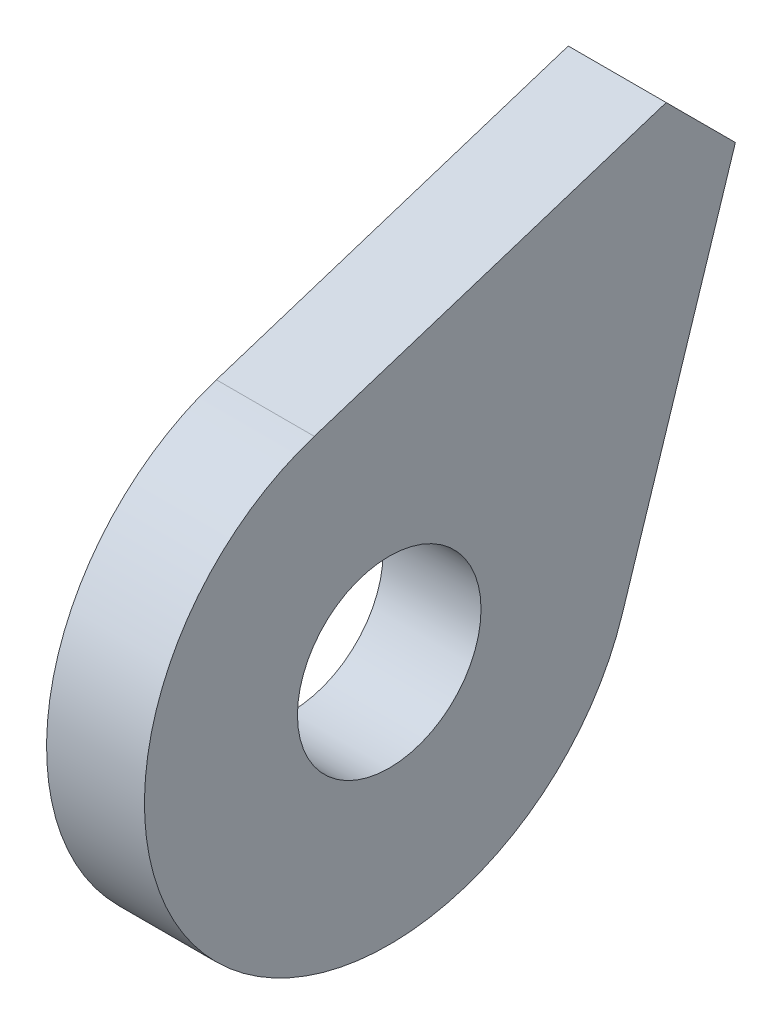
ISO-10303-21;
HEADER;
FILE_DESCRIPTION(('STEP AP214'),'2;1');
FILE_NAME('part.step','',(''),(''),'','','');
FILE_SCHEMA(('AUTOMOTIVE_DESIGN { 1 0 10303 214 1 1 1 1 }'));
ENDSEC;
DATA;
#1=APPLICATION_CONTEXT('core data for automotive mechanical design processes');
#2=APPLICATION_PROTOCOL_DEFINITION('international standard','automotive_design',2000,#1);
#3=PRODUCT_CONTEXT('',#1,'mechanical');
#4=PRODUCT('Part','Part','',(#3));
#5=PRODUCT_RELATED_PRODUCT_CATEGORY('part','',(#4));
#6=PRODUCT_DEFINITION_FORMATION('','',#4);
#7=PRODUCT_DEFINITION_CONTEXT('part definition',#1,'design');
#8=PRODUCT_DEFINITION('design','',#6,#7);
#9=PRODUCT_DEFINITION_SHAPE('','',#8);
#10=(LENGTH_UNIT() NAMED_UNIT(*) SI_UNIT(.MILLI.,.METRE.));
#11=(NAMED_UNIT(*) PLANE_ANGLE_UNIT() SI_UNIT($,.RADIAN.));
#12=(NAMED_UNIT(*) SI_UNIT($,.STERADIAN.) SOLID_ANGLE_UNIT());
#13=UNCERTAINTY_MEASURE_WITH_UNIT(LENGTH_MEASURE(1.E-05),#10,'distance_accuracy_value','');
#14=(GEOMETRIC_REPRESENTATION_CONTEXT(3) GLOBAL_UNCERTAINTY_ASSIGNED_CONTEXT((#13)) GLOBAL_UNIT_ASSIGNED_CONTEXT((#10,
#11,#12)) REPRESENTATION_CONTEXT('',''));
#15=CARTESIAN_POINT('',(0.,0.,0.));
#16=DIRECTION('',(0.,0.,1.));
#17=DIRECTION('',(1.,0.,0.));
#18=AXIS2_PLACEMENT_3D('',#15,#16,#17);
#19=CARTESIAN_POINT('',(-286.7,69.3032187234195,76.8150271270258));
#20=DIRECTION('',(1.,0.,0.));
#21=DIRECTION('',(0.,0.,-1.));
#22=AXIS2_PLACEMENT_3D('',#19,#20,#21);
#23=CYLINDRICAL_SURFACE('',#22,10.);
#24=CARTESIAN_POINT('',(-282.7,69.3032187234195,76.8150271270258));
#25=DIRECTION('',(1.,0.,0.));
#26=DIRECTION('',(0.,0.,-1.));
#27=AXIS2_PLACEMENT_3D('',#24,#25,#26);
#28=CIRCLE('',#27,10.);
#29=CARTESIAN_POINT('',(-282.7,78.823176292621,79.8761393236959));
#30=VERTEX_POINT('',#29);
#31=CARTESIAN_POINT('',(-282.7,66.2421065267494,67.2950695578243));
#32=VERTEX_POINT('',#31);
#33=EDGE_CURVE('E45',#30,#32,#28,.T.);
#34=ORIENTED_EDGE('',*,*,#33,.F.);
#35=DIRECTION('',(1.,0.,0.));
#36=VECTOR('',#35,1.);
#37=CARTESIAN_POINT('',(-286.7,78.823176292621,79.8761393236959));
#38=LINE('',#37,#36);
#39=CARTESIAN_POINT('',(-286.7,78.823176292621,79.8761393236959));
#40=VERTEX_POINT('',#39);
#41=EDGE_CURVE('E39',#40,#30,#38,.T.);
#42=ORIENTED_EDGE('',*,*,#41,.F.);
#43=CARTESIAN_POINT('',(-286.7,69.3032187234195,76.8150271270258));
#44=DIRECTION('',(1.,0.,0.));
#45=DIRECTION('',(0.,0.,-1.));
#46=AXIS2_PLACEMENT_3D('',#43,#44,#45);
#47=CIRCLE('',#46,10.);
#48=CARTESIAN_POINT('',(-286.7,66.2421065267494,67.2950695578243));
#49=VERTEX_POINT('',#48);
#50=EDGE_CURVE('E105',#40,#49,#47,.T.);
#51=ORIENTED_EDGE('',*,*,#50,.T.);
#52=DIRECTION('',(1.,0.,0.));
#53=VECTOR('',#52,1.);
#54=CARTESIAN_POINT('',(-286.7,66.2421065267494,67.2950695578243));
#55=LINE('',#54,#53);
#56=EDGE_CURVE('E54',#49,#32,#55,.T.);
#57=ORIENTED_EDGE('',*,*,#56,.T.);
#58=EDGE_LOOP('',(#34,#42,#51,#57));
#59=FACE_BOUND('',#58,.T.);
#60=ADVANCED_FACE('F36',(#59),#23,.T.);
#61=CARTESIAN_POINT('',(-286.7,69.3032187234195,76.8150271270258));
#62=DIRECTION('',(1.,0.,0.));
#63=DIRECTION('',(0.,0.,-1.));
#64=AXIS2_PLACEMENT_3D('',#61,#62,#63);
#65=CYLINDRICAL_SURFACE('',#64,3.75000000000001);
#66=CARTESIAN_POINT('',(-286.7,69.3032187234195,76.8150271270258));
#67=DIRECTION('',(1.,0.,0.));
#68=DIRECTION('',(0.,0.,-1.));
#69=AXIS2_PLACEMENT_3D('',#66,#67,#68);
#70=CIRCLE('',#69,3.75000000000001);
#71=CARTESIAN_POINT('',(-286.7,69.3032187234195,73.0650271270258));
#72=VERTEX_POINT('',#71);
#73=EDGE_CURVE('E94',#72,#72,#70,.T.);
#74=ORIENTED_EDGE('',*,*,#73,.F.);
#75=EDGE_LOOP('',(#74));
#76=FACE_BOUND('',#75,.T.);
#77=CARTESIAN_POINT('',(-282.7,69.3032187234195,76.8150271270258));
#78=DIRECTION('',(1.,0.,0.));
#79=DIRECTION('',(0.,0.,-1.));
#80=AXIS2_PLACEMENT_3D('',#77,#78,#79);
#81=CIRCLE('',#80,3.75000000000001);
#82=CARTESIAN_POINT('',(-282.7,69.3032187234195,73.0650271270258));
#83=VERTEX_POINT('',#82);
#84=EDGE_CURVE('E107',#83,#83,#81,.T.);
#85=ORIENTED_EDGE('',*,*,#84,.T.);
#86=EDGE_LOOP('',(#85));
#87=FACE_BOUND('',#86,.T.);
#88=ADVANCED_FACE('F120',(#76,#87),#65,.F.);
#89=CARTESIAN_POINT('',(-282.7,69.3032187234195,76.8150271270258));
#90=DIRECTION('',(-1.,0.,0.));
#91=DIRECTION('',(0.,0.,-1.));
#92=AXIS2_PLACEMENT_3D('',#89,#90,#91);
#93=PLANE('',#92);
#94=DIRECTION('',(0.,0.951995756920153,-0.30611121966701));
#95=VECTOR('',#94,1.);
#96=CARTESIAN_POINT('',(-282.7,80.6169272224042,62.6728915032948));
#97=LINE('',#96,#95);
#98=CARTESIAN_POINT('',(-282.7,80.6169272224044,62.6728915032948));
#99=VERTEX_POINT('',#98);
#100=EDGE_CURVE('E11',#32,#99,#97,.T.);
#101=ORIENTED_EDGE('',*,*,#100,.T.);
#102=DIRECTION('',(0.,0.707106781186549,0.707106781186546));
#103=VECTOR('',#102,1.);
#104=CARTESIAN_POINT('',(-282.7,80.6169272224044,62.6728915032948));
#105=LINE('',#104,#103);
#106=CARTESIAN_POINT('',(-282.7,83.4453543471506,65.5013186280409));
#107=VERTEX_POINT('',#106);
#108=EDGE_CURVE('E80',#99,#107,#105,.T.);
#109=ORIENTED_EDGE('',*,*,#108,.T.);
#110=DIRECTION('',(0.,-0.306111219667008,0.951995756920154));
#111=VECTOR('',#110,1.);
#112=CARTESIAN_POINT('',(-282.7,78.823176292621,79.8761393236959));
#113=LINE('',#112,#111);
#114=EDGE_CURVE('E81',#107,#30,#113,.T.);
#115=ORIENTED_EDGE('',*,*,#114,.T.);
#116=ORIENTED_EDGE('',*,*,#33,.T.);
#117=EDGE_LOOP('',(#101,#109,#115,#116));
#118=FACE_BOUND('',#117,.T.);
#119=ORIENTED_EDGE('',*,*,#84,.F.);
#120=EDGE_LOOP('',(#119));
#121=FACE_BOUND('',#120,.T.);
#122=ADVANCED_FACE('F117',(#118,#121),#93,.F.);
#123=CARTESIAN_POINT('',(-286.7,80.6169272224042,62.6728915032948));
#124=DIRECTION('',(0.,-0.30611121966701,-0.951995756920153));
#125=DIRECTION('',(0.,0.951995756920153,-0.30611121966701));
#126=AXIS2_PLACEMENT_3D('',#123,#124,#125);
#127=PLANE('',#126);
#128=ORIENTED_EDGE('',*,*,#100,.F.);
#129=ORIENTED_EDGE('',*,*,#56,.F.);
#130=DIRECTION('',(0.,0.951995756920153,-0.30611121966701));
#131=VECTOR('',#130,1.);
#132=CARTESIAN_POINT('',(-286.7,80.6169272224042,62.6728915032948));
#133=LINE('',#132,#131);
#134=CARTESIAN_POINT('',(-286.7,80.6169272224044,62.6728915032948));
#135=VERTEX_POINT('',#134);
#136=EDGE_CURVE('E82',#49,#135,#133,.T.);
#137=ORIENTED_EDGE('',*,*,#136,.T.);
#138=DIRECTION('',(1.,0.,0.));
#139=VECTOR('',#138,1.);
#140=CARTESIAN_POINT('',(-286.7,80.6169272224042,62.6728915032948));
#141=LINE('',#140,#139);
#142=EDGE_CURVE('E74',#135,#99,#141,.T.);
#143=ORIENTED_EDGE('',*,*,#142,.T.);
#144=EDGE_LOOP('',(#128,#129,#137,#143));
#145=FACE_BOUND('',#144,.T.);
#146=ADVANCED_FACE('F93',(#145),#127,.T.);
#147=CARTESIAN_POINT('',(-286.7,78.823176292621,79.8761393236959));
#148=DIRECTION('',(0.,0.951995756920154,0.306111219667008));
#149=DIRECTION('',(0.,-0.306111219667008,0.951995756920154));
#150=AXIS2_PLACEMENT_3D('',#147,#148,#149);
#151=PLANE('',#150);
#152=ORIENTED_EDGE('',*,*,#114,.F.);
#153=DIRECTION('',(1.,0.,0.));
#154=VECTOR('',#153,1.);
#155=CARTESIAN_POINT('',(-286.7,83.4453543471504,65.5013186280411));
#156=LINE('',#155,#154);
#157=CARTESIAN_POINT('',(-286.7,83.4453543471506,65.501318628041));
#158=VERTEX_POINT('',#157);
#159=EDGE_CURVE('E106',#158,#107,#156,.T.);
#160=ORIENTED_EDGE('',*,*,#159,.F.);
#161=DIRECTION('',(0.,-0.306111219667008,0.951995756920154));
#162=VECTOR('',#161,1.);
#163=CARTESIAN_POINT('',(-286.7,78.823176292621,79.8761393236959));
#164=LINE('',#163,#162);
#165=EDGE_CURVE('E91',#158,#40,#164,.T.);
#166=ORIENTED_EDGE('',*,*,#165,.T.);
#167=ORIENTED_EDGE('',*,*,#41,.T.);
#168=EDGE_LOOP('',(#152,#160,#166,#167));
#169=FACE_BOUND('',#168,.T.);
#170=ADVANCED_FACE('F116',(#169),#151,.T.);
#171=CARTESIAN_POINT('',(-286.7,69.3032187234195,76.8150271270258));
#172=DIRECTION('',(-1.,0.,0.));
#173=DIRECTION('',(0.,0.,-1.));
#174=AXIS2_PLACEMENT_3D('',#171,#172,#173);
#175=PLANE('',#174);
#176=DIRECTION('',(0.,0.707106781186549,0.707106781186546));
#177=VECTOR('',#176,1.);
#178=CARTESIAN_POINT('',(-286.7,80.6169272224044,62.6728915032948));
#179=LINE('',#178,#177);
#180=EDGE_CURVE('E78',#135,#158,#179,.T.);
#181=ORIENTED_EDGE('',*,*,#180,.F.);
#182=ORIENTED_EDGE('',*,*,#136,.F.);
#183=ORIENTED_EDGE('',*,*,#50,.F.);
#184=ORIENTED_EDGE('',*,*,#165,.F.);
#185=EDGE_LOOP('',(#181,#182,#183,#184));
#186=FACE_BOUND('',#185,.T.);
#187=ORIENTED_EDGE('',*,*,#73,.T.);
#188=EDGE_LOOP('',(#187));
#189=FACE_BOUND('',#188,.T.);
#190=ADVANCED_FACE('F87',(#186,#189),#175,.T.);
#191=CARTESIAN_POINT('',(-282.55,80.6169272224044,62.6728915032948));
#192=DIRECTION('',(0.,0.707106781186546,-0.707106781186549));
#193=DIRECTION('',(0.,0.707106781186549,0.707106781186546));
#194=AXIS2_PLACEMENT_3D('',#191,#192,#193);
#195=PLANE('',#194);
#196=ORIENTED_EDGE('',*,*,#159,.T.);
#197=ORIENTED_EDGE('',*,*,#108,.F.);
#198=ORIENTED_EDGE('',*,*,#142,.F.);
#199=ORIENTED_EDGE('',*,*,#180,.T.);
#200=EDGE_LOOP('',(#196,#197,#198,#199));
#201=FACE_BOUND('',#200,.T.);
#202=ADVANCED_FACE('F77',(#201),#195,.T.);
#203=CLOSED_SHELL('',(#60,#88,#122,#146,#170,#190,#202));
#204=MANIFOLD_SOLID_BREP('B2',#203);
#205=ADVANCED_BREP_SHAPE_REPRESENTATION('',(#18,#204),#14);
#206=SHAPE_DEFINITION_REPRESENTATION(#9,#205);
ENDSEC;
END-ISO-10303-21;
